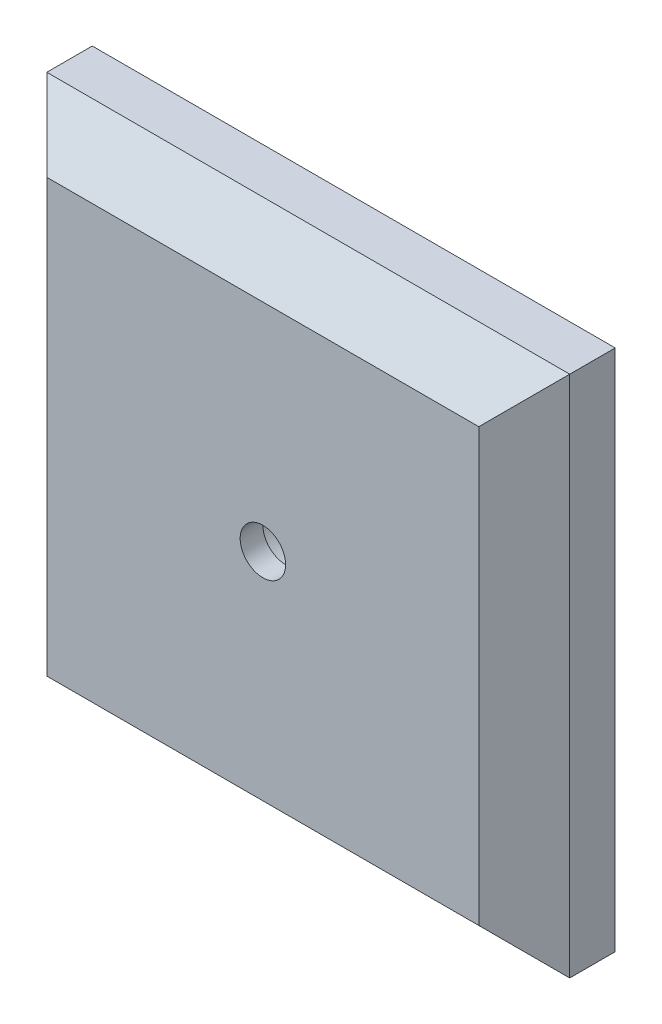
ISO-10303-21;
HEADER;
FILE_DESCRIPTION(('STEP AP214'),'2;1');
FILE_NAME('part.step','',(''),(''),'','','');
FILE_SCHEMA(('AUTOMOTIVE_DESIGN { 1 0 10303 214 1 1 1 1 }'));
ENDSEC;
DATA;
#1=APPLICATION_CONTEXT('core data for automotive mechanical design processes');
#2=APPLICATION_PROTOCOL_DEFINITION('international standard','automotive_design',2000,#1);
#3=PRODUCT_CONTEXT('',#1,'mechanical');
#4=PRODUCT('Part','Part','',(#3));
#5=PRODUCT_RELATED_PRODUCT_CATEGORY('part','',(#4));
#6=PRODUCT_DEFINITION_FORMATION('','',#4);
#7=PRODUCT_DEFINITION_CONTEXT('part definition',#1,'design');
#8=PRODUCT_DEFINITION('design','',#6,#7);
#9=PRODUCT_DEFINITION_SHAPE('','',#8);
#10=(LENGTH_UNIT() NAMED_UNIT(*) SI_UNIT(.MILLI.,.METRE.));
#11=(NAMED_UNIT(*) PLANE_ANGLE_UNIT() SI_UNIT($,.RADIAN.));
#12=(NAMED_UNIT(*) SI_UNIT($,.STERADIAN.) SOLID_ANGLE_UNIT());
#13=UNCERTAINTY_MEASURE_WITH_UNIT(LENGTH_MEASURE(1.E-05),#10,'distance_accuracy_value','');
#14=(GEOMETRIC_REPRESENTATION_CONTEXT(3) GLOBAL_UNCERTAINTY_ASSIGNED_CONTEXT((#13)) GLOBAL_UNIT_ASSIGNED_CONTEXT((#10,
#11,#12)) REPRESENTATION_CONTEXT('',''));
#15=CARTESIAN_POINT('',(0.,0.,0.));
#16=DIRECTION('',(0.,0.,1.));
#17=DIRECTION('',(1.,0.,0.));
#18=AXIS2_PLACEMENT_3D('',#15,#16,#17);
#19=CARTESIAN_POINT('',(-38.1336495726495,38.0298062678062,6.35));
#20=DIRECTION('',(1.,0.,0.));
#21=DIRECTION('',(0.,0.,-1.));
#22=AXIS2_PLACEMENT_3D('',#19,#20,#21);
#23=PLANE('',#22);
#24=DIRECTION('',(0.,0.,-1.));
#25=VECTOR('',#24,1.);
#26=CARTESIAN_POINT('',(-38.1336495726495,-34.9951937321937,6.35));
#27=LINE('',#26,#25);
#28=CARTESIAN_POINT('',(-38.1336495726495,-34.9951937321937,6.35));
#29=VERTEX_POINT('',#28);
#30=CARTESIAN_POINT('',(-38.1336495726495,-34.9951937321937,0.));
#31=VERTEX_POINT('',#30);
#32=EDGE_CURVE('E90',#29,#31,#27,.T.);
#33=ORIENTED_EDGE('',*,*,#32,.F.);
#34=DIRECTION('',(0.,1.,0.));
#35=VECTOR('',#34,1.);
#36=CARTESIAN_POINT('',(-38.1336495726495,38.0298062678062,6.35));
#37=LINE('',#36,#35);
#38=CARTESIAN_POINT('',(-38.1336495726495,38.0298062678062,6.35));
#39=VERTEX_POINT('',#38);
#40=EDGE_CURVE('E11',#29,#39,#37,.T.);
#41=ORIENTED_EDGE('',*,*,#40,.T.);
#42=DIRECTION('',(0.,0.,-1.));
#43=VECTOR('',#42,1.);
#44=CARTESIAN_POINT('',(-38.1336495726495,38.0298062678062,6.35));
#45=LINE('',#44,#43);
#46=CARTESIAN_POINT('',(-38.1336495726495,38.0298062678062,0.));
#47=VERTEX_POINT('',#46);
#48=EDGE_CURVE('E110',#39,#47,#45,.T.);
#49=ORIENTED_EDGE('',*,*,#48,.T.);
#50=DIRECTION('',(0.,-1.,0.));
#51=VECTOR('',#50,1.);
#52=CARTESIAN_POINT('',(-38.1336495726495,38.0298062678062,0.));
#53=LINE('',#52,#51);
#54=EDGE_CURVE('E106',#47,#31,#53,.T.);
#55=ORIENTED_EDGE('',*,*,#54,.T.);
#56=EDGE_LOOP('',(#33,#41,#49,#55));
#57=FACE_BOUND('',#56,.T.);
#58=ADVANCED_FACE('F37',(#57),#23,.F.);
#59=CARTESIAN_POINT('',(-38.1336495726495,-34.9951937321937,6.35));
#60=DIRECTION('',(0.,1.,0.));
#61=DIRECTION('',(-1.,0.,0.));
#62=AXIS2_PLACEMENT_3D('',#59,#60,#61);
#63=PLANE('',#62);
#64=DIRECTION('',(0.,0.,-1.));
#65=VECTOR('',#64,1.);
#66=CARTESIAN_POINT('',(34.8913504273505,-34.9951937321937,6.35));
#67=LINE('',#66,#65);
#68=CARTESIAN_POINT('',(34.8913504273505,-34.9951937321937,6.35));
#69=VERTEX_POINT('',#68);
#70=CARTESIAN_POINT('',(34.8913504273505,-34.9951937321937,0.));
#71=VERTEX_POINT('',#70);
#72=EDGE_CURVE('E100',#69,#71,#67,.T.);
#73=ORIENTED_EDGE('',*,*,#72,.F.);
#74=DIRECTION('',(-1.,0.,0.));
#75=VECTOR('',#74,1.);
#76=CARTESIAN_POINT('',(-38.1336495726495,-34.9951937321937,6.35));
#77=LINE('',#76,#75);
#78=EDGE_CURVE('E97',#69,#29,#77,.T.);
#79=ORIENTED_EDGE('',*,*,#78,.T.);
#80=ORIENTED_EDGE('',*,*,#32,.T.);
#81=DIRECTION('',(1.,0.,0.));
#82=VECTOR('',#81,1.);
#83=CARTESIAN_POINT('',(-38.1336495726495,-34.9951937321937,0.));
#84=LINE('',#83,#82);
#85=EDGE_CURVE('E94',#31,#71,#84,.T.);
#86=ORIENTED_EDGE('',*,*,#85,.T.);
#87=EDGE_LOOP('',(#73,#79,#80,#86));
#88=FACE_BOUND('',#87,.T.);
#89=ADVANCED_FACE('F93',(#88),#63,.F.);
#90=CARTESIAN_POINT('',(34.8913504273504,38.0298062678063,6.35));
#91=DIRECTION('',(-1.,0.,0.));
#92=DIRECTION('',(0.,-1.,0.));
#93=AXIS2_PLACEMENT_3D('',#90,#91,#92);
#94=PLANE('',#93);
#95=DIRECTION('',(0.,0.,-1.));
#96=VECTOR('',#95,1.);
#97=CARTESIAN_POINT('',(34.8913504273504,38.0298062678063,6.35));
#98=LINE('',#97,#96);
#99=CARTESIAN_POINT('',(34.8913504273504,38.0298062678063,6.35));
#100=VERTEX_POINT('',#99);
#101=CARTESIAN_POINT('',(34.8913504273504,38.0298062678063,0.));
#102=VERTEX_POINT('',#101);
#103=EDGE_CURVE('E123',#100,#102,#98,.T.);
#104=ORIENTED_EDGE('',*,*,#103,.F.);
#105=DIRECTION('',(0.,-1.,0.));
#106=VECTOR('',#105,1.);
#107=CARTESIAN_POINT('',(34.8913504273505,-34.9951937321937,6.35));
#108=LINE('',#107,#106);
#109=EDGE_CURVE('E135',#100,#69,#108,.T.);
#110=ORIENTED_EDGE('',*,*,#109,.T.);
#111=ORIENTED_EDGE('',*,*,#72,.T.);
#112=DIRECTION('',(0.,1.,0.));
#113=VECTOR('',#112,1.);
#114=CARTESIAN_POINT('',(34.8913504273504,38.0298062678063,0.));
#115=LINE('',#114,#113);
#116=EDGE_CURVE('E108',#71,#102,#115,.T.);
#117=ORIENTED_EDGE('',*,*,#116,.T.);
#118=EDGE_LOOP('',(#104,#110,#111,#117));
#119=FACE_BOUND('',#118,.T.);
#120=ADVANCED_FACE('F185',(#119),#94,.F.);
#121=CARTESIAN_POINT('',(-38.1336495726495,38.0298062678062,6.35));
#122=DIRECTION('',(0.,-1.,0.));
#123=DIRECTION('',(1.,0.,0.));
#124=AXIS2_PLACEMENT_3D('',#121,#122,#123);
#125=PLANE('',#124);
#126=ORIENTED_EDGE('',*,*,#48,.F.);
#127=DIRECTION('',(1.,0.,0.));
#128=VECTOR('',#127,1.);
#129=CARTESIAN_POINT('',(34.8913504273505,38.0298062678063,6.35));
#130=LINE('',#129,#128);
#131=EDGE_CURVE('E46',#39,#100,#130,.T.);
#132=ORIENTED_EDGE('',*,*,#131,.T.);
#133=ORIENTED_EDGE('',*,*,#103,.T.);
#134=DIRECTION('',(-1.,0.,0.));
#135=VECTOR('',#134,1.);
#136=CARTESIAN_POINT('',(-38.1336495726495,38.0298062678062,0.));
#137=LINE('',#136,#135);
#138=EDGE_CURVE('E120',#102,#47,#137,.T.);
#139=ORIENTED_EDGE('',*,*,#138,.T.);
#140=EDGE_LOOP('',(#126,#132,#133,#139));
#141=FACE_BOUND('',#140,.T.);
#142=ADVANCED_FACE('F177',(#141),#125,.F.);
#143=CARTESIAN_POINT('',(0.,0.,0.));
#144=DIRECTION('',(0.,0.,1.));
#145=DIRECTION('',(1.,0.,0.));
#146=AXIS2_PLACEMENT_3D('',#143,#144,#145);
#147=PLANE('',#146);
#148=CARTESIAN_POINT('',(-1.60844957264953,1.50460626780627,0.));
#149=DIRECTION('',(0.,0.,-1.));
#150=DIRECTION('',(-1.,0.,0.));
#151=AXIS2_PLACEMENT_3D('',#148,#149,#150);
#152=CIRCLE('',#151,6.35);
#153=CARTESIAN_POINT('',(-7.95844957264953,1.50460626780627,0.));
#154=VERTEX_POINT('',#153);
#155=EDGE_CURVE('E148',#154,#154,#152,.T.);
#156=ORIENTED_EDGE('',*,*,#155,.F.);
#157=EDGE_LOOP('',(#156));
#158=FACE_BOUND('',#157,.T.);
#159=ORIENTED_EDGE('',*,*,#54,.F.);
#160=ORIENTED_EDGE('',*,*,#138,.F.);
#161=ORIENTED_EDGE('',*,*,#116,.F.);
#162=ORIENTED_EDGE('',*,*,#85,.F.);
#163=EDGE_LOOP('',(#159,#160,#161,#162));
#164=FACE_BOUND('',#163,.T.);
#165=ADVANCED_FACE('F104',(#158,#164),#147,.F.);
#166=CARTESIAN_POINT('',(0.,0.,12.7));
#167=DIRECTION('',(0.,0.,1.));
#168=DIRECTION('',(1.,0.,0.));
#169=AXIS2_PLACEMENT_3D('',#166,#167,#168);
#170=PLANE('',#169);
#171=DIRECTION('',(0.,-1.,0.));
#172=VECTOR('',#171,1.);
#173=CARTESIAN_POINT('',(-31.7836495726495,-34.9951937321937,12.7));
#174=LINE('',#173,#172);
#175=CARTESIAN_POINT('',(-31.7836495726495,31.6798062678062,12.7));
#176=VERTEX_POINT('',#175);
#177=CARTESIAN_POINT('',(-31.7836495726495,-28.6451937321937,12.7));
#178=VERTEX_POINT('',#177);
#179=EDGE_CURVE('E99',#176,#178,#174,.T.);
#180=ORIENTED_EDGE('',*,*,#179,.T.);
#181=DIRECTION('',(1.,0.,0.));
#182=VECTOR('',#181,1.);
#183=CARTESIAN_POINT('',(34.8913504273505,-28.6451937321937,12.7));
#184=LINE('',#183,#182);
#185=CARTESIAN_POINT('',(28.5413504273504,-28.6451937321937,12.7));
#186=VERTEX_POINT('',#185);
#187=EDGE_CURVE('E131',#178,#186,#184,.T.);
#188=ORIENTED_EDGE('',*,*,#187,.T.);
#189=DIRECTION('',(0.,1.,0.));
#190=VECTOR('',#189,1.);
#191=CARTESIAN_POINT('',(28.5413504273504,38.0298062678062,12.7));
#192=LINE('',#191,#190);
#193=CARTESIAN_POINT('',(28.5413504273504,31.6798062678062,12.7));
#194=VERTEX_POINT('',#193);
#195=EDGE_CURVE('E129',#186,#194,#192,.T.);
#196=ORIENTED_EDGE('',*,*,#195,.T.);
#197=DIRECTION('',(-1.,0.,0.));
#198=VECTOR('',#197,1.);
#199=CARTESIAN_POINT('',(-38.1336495726495,31.6798062678062,12.7));
#200=LINE('',#199,#198);
#201=EDGE_CURVE('E127',#194,#176,#200,.T.);
#202=ORIENTED_EDGE('',*,*,#201,.T.);
#203=EDGE_LOOP('',(#180,#188,#196,#202));
#204=FACE_BOUND('',#203,.T.);
#205=CARTESIAN_POINT('',(-1.60844957264953,1.50460626780627,12.7));
#206=DIRECTION('',(0.,0.,1.));
#207=DIRECTION('',(1.,0.,0.));
#208=AXIS2_PLACEMENT_3D('',#205,#206,#207);
#209=CIRCLE('',#208,3.175);
#210=CARTESIAN_POINT('',(1.56655042735047,1.50460626780627,12.7));
#211=VERTEX_POINT('',#210);
#212=EDGE_CURVE('E112',#211,#211,#209,.T.);
#213=ORIENTED_EDGE('',*,*,#212,.F.);
#214=EDGE_LOOP('',(#213));
#215=FACE_BOUND('',#214,.T.);
#216=ADVANCED_FACE('F167',(#204,#215),#170,.T.);
#217=CARTESIAN_POINT('',(-1.60844957264953,1.50460626780627,9.525));
#218=DIRECTION('',(0.,0.,1.));
#219=DIRECTION('',(1.,0.,0.));
#220=AXIS2_PLACEMENT_3D('',#217,#218,#219);
#221=CYLINDRICAL_SURFACE('',#220,3.175);
#222=CARTESIAN_POINT('',(-1.60844957264953,1.50460626780627,9.525));
#223=DIRECTION('',(0.,0.,1.));
#224=DIRECTION('',(1.,0.,0.));
#225=AXIS2_PLACEMENT_3D('',#222,#223,#224);
#226=CIRCLE('',#225,3.175);
#227=CARTESIAN_POINT('',(1.56655042735047,1.50460626780627,9.525));
#228=VERTEX_POINT('',#227);
#229=EDGE_CURVE('E115',#228,#228,#226,.T.);
#230=ORIENTED_EDGE('',*,*,#229,.F.);
#231=EDGE_LOOP('',(#230));
#232=FACE_BOUND('',#231,.T.);
#233=ORIENTED_EDGE('',*,*,#212,.T.);
#234=EDGE_LOOP('',(#233));
#235=FACE_BOUND('',#234,.T.);
#236=ADVANCED_FACE('F164',(#232,#235),#221,.F.);
#237=CARTESIAN_POINT('',(-1.60844957264953,1.50460626780627,9.525));
#238=DIRECTION('',(0.,0.,-1.));
#239=DIRECTION('',(-1.,0.,0.));
#240=AXIS2_PLACEMENT_3D('',#237,#238,#239);
#241=PLANE('',#240);
#242=CARTESIAN_POINT('',(-1.60844957264953,1.50460626780627,9.525));
#243=DIRECTION('',(0.,0.,-1.));
#244=DIRECTION('',(-1.,0.,0.));
#245=AXIS2_PLACEMENT_3D('',#242,#243,#244);
#246=CIRCLE('',#245,6.35);
#247=CARTESIAN_POINT('',(-7.95844957264953,1.50460626780627,9.525));
#248=VERTEX_POINT('',#247);
#249=EDGE_CURVE('E153',#248,#248,#246,.T.);
#250=ORIENTED_EDGE('',*,*,#249,.T.);
#251=EDGE_LOOP('',(#250));
#252=FACE_BOUND('',#251,.T.);
#253=ORIENTED_EDGE('',*,*,#229,.T.);
#254=EDGE_LOOP('',(#253));
#255=FACE_BOUND('',#254,.T.);
#256=ADVANCED_FACE('F162',(#252,#255),#241,.T.);
#257=CARTESIAN_POINT('',(-1.60844957264953,1.50460626780627,9.525));
#258=DIRECTION('',(0.,0.,-1.));
#259=DIRECTION('',(-1.,0.,0.));
#260=AXIS2_PLACEMENT_3D('',#257,#258,#259);
#261=CYLINDRICAL_SURFACE('',#260,6.35);
#262=CARTESIAN_POINT('',(-7.95844957264953,1.50460626780627,9.525));
#263=CARTESIAN_POINT('',(-7.95844957264953,1.50460626780627,9.42578125));
#264=CARTESIAN_POINT('',(-7.95844957264953,1.50460626780627,9.3265625));
#265=CARTESIAN_POINT('',(-7.95844957264953,1.50460626780627,9.128125));
#266=CARTESIAN_POINT('',(-7.95844957264953,1.50460626780627,9.02890625));
#267=CARTESIAN_POINT('',(-7.95844957264953,1.50460626780627,8.83046875));
#268=CARTESIAN_POINT('',(-7.95844957264953,1.50460626780627,8.73125));
#269=CARTESIAN_POINT('',(-7.95844957264953,1.50460626780627,8.5328125));
#270=CARTESIAN_POINT('',(-7.95844957264953,1.50460626780627,8.43359375));
#271=CARTESIAN_POINT('',(-7.95844957264953,1.50460626780627,8.23515625));
#272=CARTESIAN_POINT('',(-7.95844957264953,1.50460626780627,8.1359375));
#273=CARTESIAN_POINT('',(-7.95844957264953,1.50460626780627,7.9375));
#274=CARTESIAN_POINT('',(-7.95844957264953,1.50460626780627,7.83828125));
#275=CARTESIAN_POINT('',(-7.95844957264953,1.50460626780627,7.63984375));
#276=CARTESIAN_POINT('',(-7.95844957264953,1.50460626780627,7.540625));
#277=CARTESIAN_POINT('',(-7.95844957264953,1.50460626780627,7.3421875));
#278=CARTESIAN_POINT('',(-7.95844957264953,1.50460626780627,7.24296875));
#279=CARTESIAN_POINT('',(-7.95844957264953,1.50460626780627,7.04453125));
#280=CARTESIAN_POINT('',(-7.95844957264953,1.50460626780627,6.9453125));
#281=CARTESIAN_POINT('',(-7.95844957264953,1.50460626780627,6.746875));
#282=CARTESIAN_POINT('',(-7.95844957264953,1.50460626780627,6.64765625));
#283=CARTESIAN_POINT('',(-7.95844957264953,1.50460626780627,6.44921875));
#284=CARTESIAN_POINT('',(-7.95844957264953,1.50460626780627,6.35));
#285=CARTESIAN_POINT('',(-7.95844957264953,1.50460626780627,6.1515625));
#286=CARTESIAN_POINT('',(-7.95844957264953,1.50460626780627,6.05234375));
#287=CARTESIAN_POINT('',(-7.95844957264953,1.50460626780627,5.85390625));
#288=CARTESIAN_POINT('',(-7.95844957264953,1.50460626780627,5.7546875));
#289=CARTESIAN_POINT('',(-7.95844957264953,1.50460626780627,5.55625));
#290=CARTESIAN_POINT('',(-7.95844957264953,1.50460626780627,5.45703125));
#291=CARTESIAN_POINT('',(-7.95844957264953,1.50460626780627,5.25859375));
#292=CARTESIAN_POINT('',(-7.95844957264953,1.50460626780627,5.159375));
#293=CARTESIAN_POINT('',(-7.95844957264953,1.50460626780627,4.9609375));
#294=CARTESIAN_POINT('',(-7.95844957264953,1.50460626780627,4.86171875));
#295=CARTESIAN_POINT('',(-7.95844957264953,1.50460626780627,4.66328125));
#296=CARTESIAN_POINT('',(-7.95844957264953,1.50460626780627,4.5640625));
#297=CARTESIAN_POINT('',(-7.95844957264953,1.50460626780627,4.365625));
#298=CARTESIAN_POINT('',(-7.95844957264953,1.50460626780627,4.26640625));
#299=CARTESIAN_POINT('',(-7.95844957264953,1.50460626780627,4.06796875));
#300=CARTESIAN_POINT('',(-7.95844957264953,1.50460626780627,3.96875));
#301=CARTESIAN_POINT('',(-7.95844957264953,1.50460626780627,3.7703125));
#302=CARTESIAN_POINT('',(-7.95844957264953,1.50460626780627,3.67109375));
#303=CARTESIAN_POINT('',(-7.95844957264953,1.50460626780627,3.47265625));
#304=CARTESIAN_POINT('',(-7.95844957264953,1.50460626780627,3.3734375));
#305=CARTESIAN_POINT('',(-7.95844957264953,1.50460626780627,3.175));
#306=CARTESIAN_POINT('',(-7.95844957264953,1.50460626780627,3.07578125));
#307=CARTESIAN_POINT('',(-7.95844957264953,1.50460626780627,2.87734375));
#308=CARTESIAN_POINT('',(-7.95844957264953,1.50460626780627,2.778125));
#309=CARTESIAN_POINT('',(-7.95844957264953,1.50460626780627,2.5796875));
#310=CARTESIAN_POINT('',(-7.95844957264953,1.50460626780627,2.48046875));
#311=CARTESIAN_POINT('',(-7.95844957264953,1.50460626780627,2.28203125));
#312=CARTESIAN_POINT('',(-7.95844957264953,1.50460626780627,2.1828125));
#313=CARTESIAN_POINT('',(-7.95844957264953,1.50460626780627,1.984375));
#314=CARTESIAN_POINT('',(-7.95844957264953,1.50460626780627,1.88515625));
#315=CARTESIAN_POINT('',(-7.95844957264953,1.50460626780627,1.68671875));
#316=CARTESIAN_POINT('',(-7.95844957264953,1.50460626780627,1.5875));
#317=CARTESIAN_POINT('',(-7.95844957264953,1.50460626780627,1.3890625));
#318=CARTESIAN_POINT('',(-7.95844957264953,1.50460626780627,1.28984375));
#319=CARTESIAN_POINT('',(-7.95844957264953,1.50460626780627,1.09140625));
#320=CARTESIAN_POINT('',(-7.95844957264953,1.50460626780627,0.992187500000001));
#321=CARTESIAN_POINT('',(-7.95844957264953,1.50460626780627,0.793750000000001));
#322=CARTESIAN_POINT('',(-7.95844957264953,1.50460626780627,0.69453125));
#323=CARTESIAN_POINT('',(-7.95844957264953,1.50460626780627,0.49609375));
#324=CARTESIAN_POINT('',(-7.95844957264953,1.50460626780627,0.396875));
#325=CARTESIAN_POINT('',(-7.95844957264953,1.50460626780627,0.1984375));
#326=CARTESIAN_POINT('',(-7.95844957264953,1.50460626780627,0.0992187500000001));
#327=CARTESIAN_POINT('',(-7.95844957264953,1.50460626780627,0.));
#328=B_SPLINE_CURVE_WITH_KNOTS('',3,(#262,#263,#264,#265,#266,#267,#268,#269,#270,#271,#272,
#273,#274,#275,#276,#277,#278,#279,#280,#281,#282,#283,#284,#285,#286,#287,#288,#289,#290,#291,
#292,#293,#294,#295,#296,#297,#298,#299,#300,#301,#302,#303,#304,#305,#306,#307,#308,#309,#310,
#311,#312,#313,#314,#315,#316,#317,#318,#319,#320,#321,#322,#323,#324,#325,#326,#327),
.UNSPECIFIED.,.F.,.F.,(4,2,2,2,2,2,2,2,2,2,2,2,2,2,2,2,2,2,2,2,2,2,2,2,2,2,2,2,2,2,2,2,4),(0.,
0.29765625,0.5953125,0.892968750000001,1.190625,1.48828125,1.7859375,2.08359375,2.38125,
2.67890625,2.9765625,3.27421875,3.571875,3.86953125,4.1671875,4.46484375,4.7625,5.06015625,
5.3578125,5.65546875,5.953125,6.25078125,6.5484375,6.84609375,7.14375,7.44140625,7.7390625,
8.03671875,8.334375,8.63203125,8.9296875,9.22734375,9.525),.UNSPECIFIED.);
#329=EDGE_CURVE('BSEAM200',#248,#154,#328,.T.);
#330=ORIENTED_EDGE('',*,*,#249,.F.);
#331=ORIENTED_EDGE('',*,*,#155,.T.);
#332=ORIENTED_EDGE('',*,*,#329,.T.);
#333=ORIENTED_EDGE('',*,*,#329,.F.);
#334=EDGE_LOOP('',(#330,#332,#331,#333));
#335=FACE_BOUND('',#334,.T.);
#336=ADVANCED_FACE('F200',(#335),#261,.F.);
#337=CARTESIAN_POINT('',(0.,31.6798062678062,12.7));
#338=DIRECTION('',(0.,0.707106781186546,0.707106781186549));
#339=DIRECTION('',(1.,0.,0.));
#340=AXIS2_PLACEMENT_3D('',#337,#338,#339);
#341=PLANE('',#340);
#342=DIRECTION('',(0.577350269189627,0.577350269189627,-0.577350269189624));
#343=VECTOR('',#342,1.);
#344=CARTESIAN_POINT('',(19.0275669515669,22.1660227920227,22.2137834757835));
#345=LINE('',#344,#343);
#346=EDGE_CURVE('E141',#100,#194,#345,.F.);
#347=ORIENTED_EDGE('',*,*,#346,.F.);
#348=ORIENTED_EDGE('',*,*,#131,.F.);
#349=DIRECTION('',(-0.577350269189627,0.577350269189627,-0.577350269189624));
#350=VECTOR('',#349,1.);
#351=CARTESIAN_POINT('',(-21.2237141500474,21.1198708452041,23.259935422602));
#352=LINE('',#351,#350);
#353=EDGE_CURVE('E41',#176,#39,#352,.T.);
#354=ORIENTED_EDGE('',*,*,#353,.F.);
#355=ORIENTED_EDGE('',*,*,#201,.F.);
#356=EDGE_LOOP('',(#347,#348,#354,#355));
#357=FACE_BOUND('',#356,.T.);
#358=ADVANCED_FACE('F39',(#357),#341,.T.);
#359=CARTESIAN_POINT('',(-31.7836495726495,0.,12.7));
#360=DIRECTION('',(-0.707106781186545,0.,0.707106781186549));
#361=DIRECTION('',(0.,1.,0.));
#362=AXIS2_PLACEMENT_3D('',#359,#360,#361);
#363=PLANE('',#362);
#364=ORIENTED_EDGE('',*,*,#353,.T.);
#365=ORIENTED_EDGE('',*,*,#40,.F.);
#366=DIRECTION('',(0.577350269189627,0.577350269189627,0.577350269189624));
#367=VECTOR('',#366,1.);
#368=CARTESIAN_POINT('',(-22.2352516619182,-19.0967958214624,22.2483979107312));
#369=LINE('',#368,#367);
#370=EDGE_CURVE('E140',#178,#29,#369,.F.);
#371=ORIENTED_EDGE('',*,*,#370,.F.);
#372=ORIENTED_EDGE('',*,*,#179,.F.);
#373=EDGE_LOOP('',(#364,#365,#371,#372));
#374=FACE_BOUND('',#373,.T.);
#375=ADVANCED_FACE('F195',(#374),#363,.T.);
#376=CARTESIAN_POINT('',(28.5413504273504,0.,12.7));
#377=DIRECTION('',(0.707106781186545,0.,0.707106781186549));
#378=DIRECTION('',(0.,-1.,0.));
#379=AXIS2_PLACEMENT_3D('',#376,#377,#378);
#380=PLANE('',#379);
#381=ORIENTED_EDGE('',*,*,#346,.T.);
#382=ORIENTED_EDGE('',*,*,#195,.F.);
#383=DIRECTION('',(0.577350269189627,-0.577350269189627,-0.577350269189624));
#384=VECTOR('',#383,1.);
#385=CARTESIAN_POINT('',(18.9929525166192,-19.0967958214624,22.2483979107312));
#386=LINE('',#385,#384);
#387=EDGE_CURVE('E138',#69,#186,#386,.F.);
#388=ORIENTED_EDGE('',*,*,#387,.F.);
#389=ORIENTED_EDGE('',*,*,#109,.F.);
#390=EDGE_LOOP('',(#381,#382,#388,#389));
#391=FACE_BOUND('',#390,.T.);
#392=ADVANCED_FACE('F192',(#391),#380,.T.);
#393=CARTESIAN_POINT('',(0.,-28.6451937321937,12.7));
#394=DIRECTION('',(0.,-0.707106781186545,0.707106781186549));
#395=DIRECTION('',(-1.,0.,0.));
#396=AXIS2_PLACEMENT_3D('',#393,#394,#395);
#397=PLANE('',#396);
#398=ORIENTED_EDGE('',*,*,#370,.T.);
#399=ORIENTED_EDGE('',*,*,#78,.F.);
#400=ORIENTED_EDGE('',*,*,#387,.T.);
#401=ORIENTED_EDGE('',*,*,#187,.F.);
#402=EDGE_LOOP('',(#398,#399,#400,#401));
#403=FACE_BOUND('',#402,.T.);
#404=ADVANCED_FACE('F189',(#403),#397,.T.);
#405=CLOSED_SHELL('',(#58,#89,#120,#142,#165,#216,#236,#256,#336,#358,#375,#392,#404));
#406=MANIFOLD_SOLID_BREP('B2',#405);
#407=ADVANCED_BREP_SHAPE_REPRESENTATION('',(#18,#406),#14);
#408=SHAPE_DEFINITION_REPRESENTATION(#9,#407);
ENDSEC;
END-ISO-10303-21;
